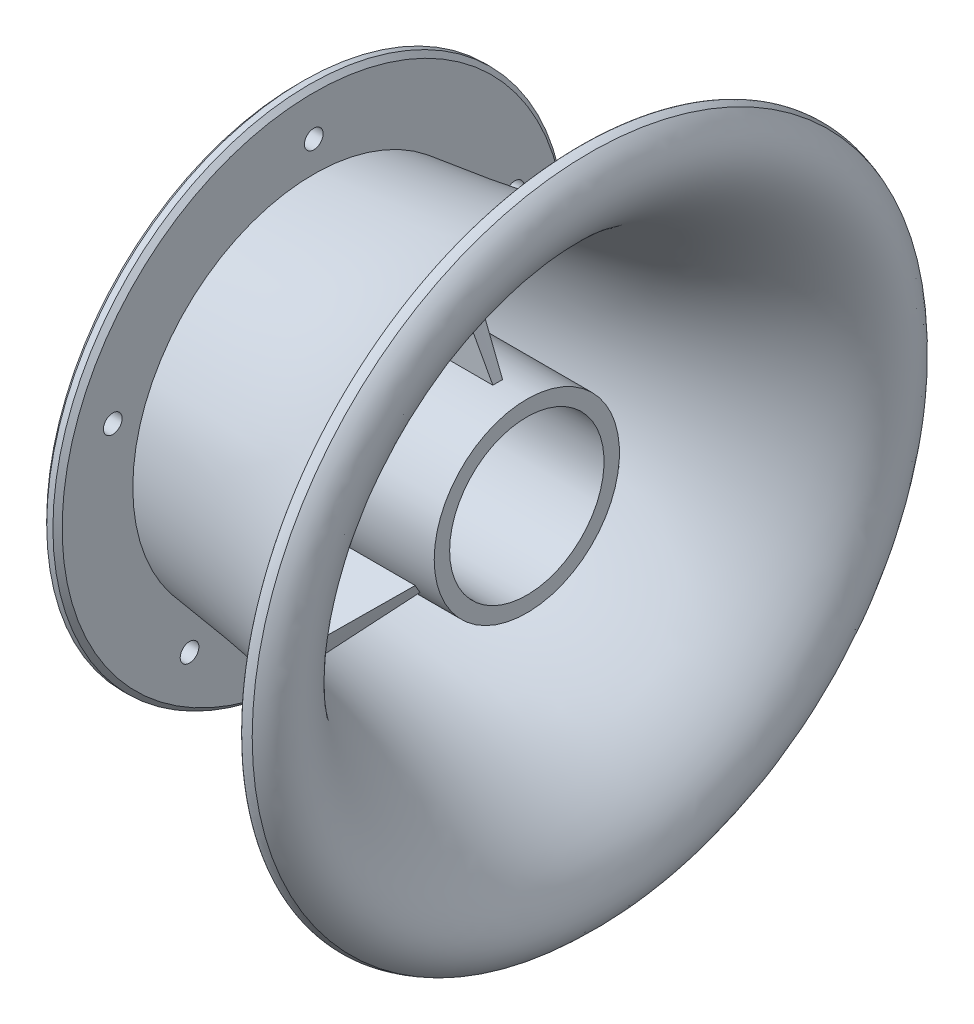
ISO-10303-21;
HEADER;
FILE_DESCRIPTION(('STEP AP214'),'2;1');
FILE_NAME('part.step','',(''),(''),'','','');
FILE_SCHEMA(('AUTOMOTIVE_DESIGN { 1 0 10303 214 1 1 1 1 }'));
ENDSEC;
DATA;
#1=APPLICATION_CONTEXT('core data for automotive mechanical design processes');
#2=APPLICATION_PROTOCOL_DEFINITION('international standard','automotive_design',2000,#1);
#3=PRODUCT_CONTEXT('',#1,'mechanical');
#4=PRODUCT('Part','Part','',(#3));
#5=PRODUCT_RELATED_PRODUCT_CATEGORY('part','',(#4));
#6=PRODUCT_DEFINITION_FORMATION('','',#4);
#7=PRODUCT_DEFINITION_CONTEXT('part definition',#1,'design');
#8=PRODUCT_DEFINITION('design','',#6,#7);
#9=PRODUCT_DEFINITION_SHAPE('','',#8);
#10=(LENGTH_UNIT() NAMED_UNIT(*) SI_UNIT(.MILLI.,.METRE.));
#11=(NAMED_UNIT(*) PLANE_ANGLE_UNIT() SI_UNIT($,.RADIAN.));
#12=(NAMED_UNIT(*) SI_UNIT($,.STERADIAN.) SOLID_ANGLE_UNIT());
#13=UNCERTAINTY_MEASURE_WITH_UNIT(LENGTH_MEASURE(1.E-05),#10,'distance_accuracy_value','');
#14=(GEOMETRIC_REPRESENTATION_CONTEXT(3) GLOBAL_UNCERTAINTY_ASSIGNED_CONTEXT((#13)) GLOBAL_UNIT_ASSIGNED_CONTEXT((#10,
#11,#12)) REPRESENTATION_CONTEXT('',''));
#15=CARTESIAN_POINT('',(0.,0.,0.));
#16=DIRECTION('',(0.,0.,1.));
#17=DIRECTION('',(1.,0.,0.));
#18=AXIS2_PLACEMENT_3D('',#15,#16,#17);
#19=CARTESIAN_POINT('',(0.,-27.231951750751,41.9335283972715));
#20=CARTESIAN_POINT('',(27.0974458304897,-30.93647253479,47.6379901603362));
#21=CARTESIAN_POINT('',(62.5423853870028,-28.8276869558013,44.3907451310539));
#22=CARTESIAN_POINT('',(108.9369423421,-52.9023203584547,81.462429624481));
#23=CARTESIAN_POINT('',(94.3435968032196,-59.5261281442564,91.6621991608794));
#24=B_SPLINE_CURVE_WITH_KNOTS('',3,(#19,#20,#21,#22,#23),.UNSPECIFIED.,.F.,.F.,(4,1,4),(0.,
0.617162194181645,1.),.UNSPECIFIED.);
#25=CARTESIAN_POINT('',(0.,0.,0.));
#26=DIRECTION('',(-1.,0.,0.));
#27=AXIS1_PLACEMENT('',#25,#26);
#28=SURFACE_OF_REVOLUTION('',#24,#27);
#29=CARTESIAN_POINT('',(23.2100864138461,0.,0.));
#30=DIRECTION('',(-1.,0.,0.));
#31=DIRECTION('',(0.,-0.866025403784443,-0.499999999999992));
#32=AXIS2_PLACEMENT_3D('',#29,#30,#31);
#33=CIRCLE('',#32,54.3792883998535);
#34=CARTESIAN_POINT('',(23.2100864138461,-29.6170831588997,45.6063086867734));
#35=VERTEX_POINT('',#34);
#36=CARTESIAN_POINT('',(23.2100864138461,-24.68768031613,48.4523007449906));
#37=VERTEX_POINT('',#36);
#38=EDGE_CURVE('E12',#35,#37,#33,.T.);
#39=ORIENTED_EDGE('',*,*,#38,.F.);
#40=CARTESIAN_POINT('',(50.7294225341509,-32.5143172846174,50.0676580089343));
#41=VERTEX_POINT('',#40);
#42=EDGE_CURVE('E124',#35,#41,#24,.T.);
#43=ORIENTED_EDGE('',*,*,#42,.T.);
#44=CARTESIAN_POINT('',(50.7294225341509,0.,0.));
#45=DIRECTION('',(-1.,0.,0.));
#46=DIRECTION('',(0.,-0.866025403784443,-0.499999999999992));
#47=AXIS2_PLACEMENT_3D('',#44,#45,#46);
#48=CIRCLE('',#47,59.6988375681166);
#49=CARTESIAN_POINT('',(50.7294225341509,-27.1027051014188,53.1920537596538));
#50=VERTEX_POINT('',#49);
#51=EDGE_CURVE('E75',#41,#50,#48,.T.);
#52=ORIENTED_EDGE('',*,*,#51,.T.);
#53=CARTESIAN_POINT('',(0.,-22.6995249869769,44.5503262094186));
#54=CARTESIAN_POINT('',(27.0974458304897,-25.7874733966883,50.6107661987763));
#55=CARTESIAN_POINT('',(62.5423853870028,-24.0296694985116,47.1608818015966));
#56=CARTESIAN_POINT('',(108.9369423421,-44.0973733295736,86.5459681618058));
#57=CARTESIAN_POINT('',(94.3435968032196,-49.6187289679402,97.3822387422945));
#58=B_SPLINE_CURVE_WITH_KNOTS('',3,(#53,#54,#55,#56,#57),.UNSPECIFIED.,.F.,.F.,(4,1,4),(0.,
0.617162194181645,1.),.UNSPECIFIED.);
#59=EDGE_CURVE('E111',#37,#50,#58,.T.);
#60=ORIENTED_EDGE('',*,*,#59,.F.);
#61=EDGE_LOOP('',(#39,#43,#52,#60));
#62=FACE_BOUND('',#61,.T.);
#63=ADVANCED_FACE('F60',(#62),#28,.F.);
#64=CARTESIAN_POINT('',(34.5788731725122,0.,0.));
#65=DIRECTION('',(-1.,0.,0.));
#66=DIRECTION('',(0.,-0.866025403784443,-0.499999999999992));
#67=AXIS2_PLACEMENT_3D('',#64,#65,#66);
#68=CONICAL_SURFACE('',#67,30.,1.13444589163211);
#69=CARTESIAN_POINT('',(34.5788731725122,0.,0.));
#70=DIRECTION('',(-1.,0.,0.));
#71=DIRECTION('',(0.,-0.866025403784443,-0.499999999999992));
#72=AXIS2_PLACEMENT_3D('',#69,#70,#71);
#73=CIRCLE('',#72,30.);
#74=CARTESIAN_POINT('',(34.5788731725122,-16.3391710504506,25.1601170383629));
#75=VERTEX_POINT('',#74);
#76=CARTESIAN_POINT('',(34.5788731725122,-13.6197149921862,26.7301957256512));
#77=VERTEX_POINT('',#76);
#78=EDGE_CURVE('E68',#75,#77,#73,.T.);
#79=ORIENTED_EDGE('',*,*,#78,.F.);
#80=DIRECTION('',(-0.422634685929842,-0.493606427218871,0.760087243188047));
#81=VECTOR('',#80,1.);
#82=CARTESIAN_POINT('',(39.8934082582112,-10.1321824541178,15.6021927680732));
#83=LINE('',#82,#81);
#84=EDGE_CURVE('E107',#75,#35,#83,.T.);
#85=ORIENTED_EDGE('',*,*,#84,.T.);
#86=ORIENTED_EDGE('',*,*,#38,.T.);
#87=DIRECTION('',(-0.422634685929842,-0.411451648083879,0.807519327036848));
#88=VECTOR('',#87,1.);
#89=CARTESIAN_POINT('',(39.8934082582112,-8.44580406483402,16.5758237850817));
#90=LINE('',#89,#88);
#91=EDGE_CURVE('E104',#77,#37,#90,.T.);
#92=ORIENTED_EDGE('',*,*,#91,.F.);
#93=EDGE_LOOP('',(#79,#85,#86,#92));
#94=FACE_BOUND('',#93,.T.);
#95=ADVANCED_FACE('F62',(#94),#68,.F.);
#96=CARTESIAN_POINT('',(0.,0.,0.));
#97=DIRECTION('',(-1.,0.,0.));
#98=DIRECTION('',(0.,-0.866025403784443,-0.499999999999992));
#99=AXIS2_PLACEMENT_3D('',#96,#97,#98);
#100=CYLINDRICAL_SURFACE('',#99,30.);
#101=CARTESIAN_POINT('',(64.5788731725122,0.,0.));
#102=DIRECTION('',(-1.,0.,0.));
#103=DIRECTION('',(0.,-0.866025403784443,-0.499999999999992));
#104=AXIS2_PLACEMENT_3D('',#101,#102,#103);
#105=CIRCLE('',#104,30.);
#106=CARTESIAN_POINT('',(64.5788731725122,-16.3391710504506,25.1601170383629));
#107=VERTEX_POINT('',#106);
#108=CARTESIAN_POINT('',(64.5788731725122,-13.6197149921862,26.7301957256512));
#109=VERTEX_POINT('',#108);
#110=EDGE_CURVE('E83',#107,#109,#105,.T.);
#111=ORIENTED_EDGE('',*,*,#110,.F.);
#112=DIRECTION('',(1.,0.,0.));
#113=VECTOR('',#112,1.);
#114=CARTESIAN_POINT('',(0.,-16.3391710504506,25.1601170383629));
#115=LINE('',#114,#113);
#116=EDGE_CURVE('E185',#75,#107,#115,.T.);
#117=ORIENTED_EDGE('',*,*,#116,.F.);
#118=ORIENTED_EDGE('',*,*,#78,.T.);
#119=DIRECTION('',(1.,0.,0.));
#120=VECTOR('',#119,1.);
#121=CARTESIAN_POINT('',(0.,-13.6197149921862,26.7301957256512));
#122=LINE('',#121,#120);
#123=EDGE_CURVE('E116',#77,#109,#122,.T.);
#124=ORIENTED_EDGE('',*,*,#123,.T.);
#125=EDGE_LOOP('',(#111,#117,#118,#124));
#126=FACE_BOUND('',#125,.T.);
#127=ADVANCED_FACE('F141',(#126),#100,.F.);
#128=CARTESIAN_POINT('',(64.5788731725122,0.,0.));
#129=DIRECTION('',(-1.,0.,0.));
#130=DIRECTION('',(0.,-0.866025403784443,-0.499999999999992));
#131=AXIS2_PLACEMENT_3D('',#128,#129,#130);
#132=CONICAL_SURFACE('',#131,30.,1.13444589163215);
#133=DIRECTION('',(-0.422634685929804,-0.49360642721888,0.760087243188062));
#134=VECTOR('',#133,1.);
#135=CARTESIAN_POINT('',(64.534805925682,-16.3906383743343,25.2393697671928));
#136=LINE('',#135,#134);
#137=EDGE_CURVE('E184',#107,#41,#136,.T.);
#138=ORIENTED_EDGE('',*,*,#137,.F.);
#139=ORIENTED_EDGE('',*,*,#110,.T.);
#140=DIRECTION('',(-0.422634685929804,-0.411451648083887,0.807519327036864));
#141=VECTOR('',#140,1.);
#142=CARTESIAN_POINT('',(64.534805925682,-13.6626162067302,26.8143941000142));
#143=LINE('',#142,#141);
#144=EDGE_CURVE('E118',#109,#50,#143,.T.);
#145=ORIENTED_EDGE('',*,*,#144,.T.);
#146=ORIENTED_EDGE('',*,*,#51,.F.);
#147=EDGE_LOOP('',(#138,#139,#145,#146));
#148=FACE_BOUND('',#147,.T.);
#149=ADVANCED_FACE('F139',(#148),#132,.T.);
#150=CARTESIAN_POINT('',(0.,0.,0.));
#151=DIRECTION('',(0.,-0.838670567945429,-0.544639035015019));
#152=DIRECTION('',(1.,0.,0.));
#153=AXIS2_PLACEMENT_3D('',#150,#151,#152);
#154=PLANE('',#153);
#155=ORIENTED_EDGE('',*,*,#42,.F.);
#156=ORIENTED_EDGE('',*,*,#84,.F.);
#157=ORIENTED_EDGE('',*,*,#116,.T.);
#158=ORIENTED_EDGE('',*,*,#137,.T.);
#159=EDGE_LOOP('',(#155,#156,#157,#158));
#160=FACE_BOUND('',#159,.T.);
#161=ADVANCED_FACE('F137',(#160),#154,.T.);
#162=CARTESIAN_POINT('',(0.,0.,0.));
#163=DIRECTION('',(0.,-0.891006524188372,-0.453990499739538));
#164=DIRECTION('',(1.,0.,0.));
#165=AXIS2_PLACEMENT_3D('',#162,#163,#164);
#166=PLANE('',#165);
#167=ORIENTED_EDGE('',*,*,#59,.T.);
#168=ORIENTED_EDGE('',*,*,#144,.F.);
#169=ORIENTED_EDGE('',*,*,#123,.F.);
#170=ORIENTED_EDGE('',*,*,#91,.T.);
#171=EDGE_LOOP('',(#167,#168,#169,#170));
#172=FACE_BOUND('',#171,.T.);
#173=ADVANCED_FACE('F115',(#172),#166,.F.);
#174=CLOSED_SHELL('',(#63,#95,#127,#149,#161,#173));
#175=MANIFOLD_SOLID_BREP('B2',#174);
#176=CARTESIAN_POINT('',(0.,-22.6995249869776,-44.5503262094183));
#177=CARTESIAN_POINT('',(27.0974458304897,-25.787473396689,-50.6107661987759));
#178=CARTESIAN_POINT('',(62.5423853870028,-24.0296694985122,-47.1608818015963));
#179=CARTESIAN_POINT('',(108.9369423421,-44.0973733295748,-86.5459681618052));
#180=CARTESIAN_POINT('',(94.3435968032196,-49.6187289679416,-97.3822387422938));
#181=B_SPLINE_CURVE_WITH_KNOTS('',3,(#176,#177,#178,#179,#180),.UNSPECIFIED.,.F.,.F.,(4,1,4),
(0.,0.617162194181645,1.),.UNSPECIFIED.);
#182=CARTESIAN_POINT('',(0.,0.,0.));
#183=DIRECTION('',(-1.,0.,0.));
#184=AXIS1_PLACEMENT('',#182,#183);
#185=SURFACE_OF_REVOLUTION('',#181,#184);
#186=CARTESIAN_POINT('',(23.2100864138461,0.,0.));
#187=DIRECTION('',(-1.,0.,0.));
#188=DIRECTION('',(0.,0.866025403784436,-0.500000000000004));
#189=AXIS2_PLACEMENT_3D('',#186,#187,#188);
#190=CIRCLE('',#189,54.3792883998535);
#191=CARTESIAN_POINT('',(23.2100864138461,-24.6876803161307,-48.4523007449902));
#192=VERTEX_POINT('',#191);
#193=CARTESIAN_POINT('',(23.2100864138461,-29.6170831589003,-45.606308686773));
#194=VERTEX_POINT('',#193);
#195=EDGE_CURVE('E58',#192,#194,#190,.T.);
#196=ORIENTED_EDGE('',*,*,#195,.F.);
#197=CARTESIAN_POINT('',(50.7294225341509,-27.1027051014195,-53.1920537596534));
#198=VERTEX_POINT('',#197);
#199=EDGE_CURVE('E269',#192,#198,#181,.T.);
#200=ORIENTED_EDGE('',*,*,#199,.T.);
#201=CARTESIAN_POINT('',(50.7294225341509,0.,0.));
#202=DIRECTION('',(-1.,0.,0.));
#203=DIRECTION('',(0.,0.866025403784436,-0.500000000000004));
#204=AXIS2_PLACEMENT_3D('',#201,#202,#203);
#205=CIRCLE('',#204,59.6988375681166);
#206=CARTESIAN_POINT('',(50.7294225341509,-32.5143172846181,-50.0676580089338));
#207=VERTEX_POINT('',#206);
#208=EDGE_CURVE('E220',#198,#207,#205,.T.);
#209=ORIENTED_EDGE('',*,*,#208,.T.);
#210=CARTESIAN_POINT('',(0.,-27.2319517507516,-41.9335283972711));
#211=CARTESIAN_POINT('',(27.0974458304897,-30.9364725347907,-47.6379901603358));
#212=CARTESIAN_POINT('',(62.5423853870028,-28.8276869558019,-44.3907451310535));
#213=CARTESIAN_POINT('',(108.9369423421,-52.9023203584559,-81.4624296244803));
#214=CARTESIAN_POINT('',(94.3435968032196,-59.5261281442577,-91.6621991608786));
#215=B_SPLINE_CURVE_WITH_KNOTS('',3,(#210,#211,#212,#213,#214),.UNSPECIFIED.,.F.,.F.,(4,1,4),
(0.,0.617162194181645,1.),.UNSPECIFIED.);
#216=EDGE_CURVE('E256',#194,#207,#215,.T.);
#217=ORIENTED_EDGE('',*,*,#216,.F.);
#218=EDGE_LOOP('',(#196,#200,#209,#217));
#219=FACE_BOUND('',#218,.T.);
#220=ADVANCED_FACE('F205',(#219),#185,.F.);
#221=CARTESIAN_POINT('',(34.5788731725122,0.,0.));
#222=DIRECTION('',(-1.,0.,0.));
#223=DIRECTION('',(0.,0.866025403784436,-0.500000000000004));
#224=AXIS2_PLACEMENT_3D('',#221,#222,#223);
#225=CONICAL_SURFACE('',#224,30.,1.13444589163211);
#226=CARTESIAN_POINT('',(34.5788731725122,0.,0.));
#227=DIRECTION('',(-1.,0.,0.));
#228=DIRECTION('',(0.,0.866025403784436,-0.500000000000004));
#229=AXIS2_PLACEMENT_3D('',#226,#227,#228);
#230=CIRCLE('',#229,30.);
#231=CARTESIAN_POINT('',(34.5788731725122,-13.6197149921865,-26.730195725651));
#232=VERTEX_POINT('',#231);
#233=CARTESIAN_POINT('',(34.5788731725122,-16.3391710504509,-25.1601170383627));
#234=VERTEX_POINT('',#233);
#235=EDGE_CURVE('E213',#232,#234,#230,.T.);
#236=ORIENTED_EDGE('',*,*,#235,.F.);
#237=DIRECTION('',(-0.422634685929842,-0.41145164808389,-0.807519327036842));
#238=VECTOR('',#237,1.);
#239=CARTESIAN_POINT('',(39.8934082582112,-8.44580406483425,-16.5758237850816));
#240=LINE('',#239,#238);
#241=EDGE_CURVE('E252',#232,#192,#240,.T.);
#242=ORIENTED_EDGE('',*,*,#241,.T.);
#243=ORIENTED_EDGE('',*,*,#195,.T.);
#244=DIRECTION('',(-0.422634685929842,-0.493606427218881,-0.760087243188041));
#245=VECTOR('',#244,1.);
#246=CARTESIAN_POINT('',(39.8934082582112,-10.132182454118,-15.6021927680731));
#247=LINE('',#246,#245);
#248=EDGE_CURVE('E249',#234,#194,#247,.T.);
#249=ORIENTED_EDGE('',*,*,#248,.F.);
#250=EDGE_LOOP('',(#236,#242,#243,#249));
#251=FACE_BOUND('',#250,.T.);
#252=ADVANCED_FACE('F207',(#251),#225,.F.);
#253=CARTESIAN_POINT('',(0.,0.,0.));
#254=DIRECTION('',(-1.,0.,0.));
#255=DIRECTION('',(0.,0.866025403784436,-0.500000000000004));
#256=AXIS2_PLACEMENT_3D('',#253,#254,#255);
#257=CYLINDRICAL_SURFACE('',#256,30.);
#258=CARTESIAN_POINT('',(64.5788731725122,0.,0.));
#259=DIRECTION('',(-1.,0.,0.));
#260=DIRECTION('',(0.,0.866025403784436,-0.500000000000004));
#261=AXIS2_PLACEMENT_3D('',#258,#259,#260);
#262=CIRCLE('',#261,30.);
#263=CARTESIAN_POINT('',(64.5788731725122,-13.6197149921865,-26.730195725651));
#264=VERTEX_POINT('',#263);
#265=CARTESIAN_POINT('',(64.5788731725122,-16.3391710504509,-25.1601170383627));
#266=VERTEX_POINT('',#265);
#267=EDGE_CURVE('E228',#264,#266,#262,.T.);
#268=ORIENTED_EDGE('',*,*,#267,.F.);
#269=DIRECTION('',(1.,0.,0.));
#270=VECTOR('',#269,1.);
#271=CARTESIAN_POINT('',(0.,-13.6197149921865,-26.730195725651));
#272=LINE('',#271,#270);
#273=EDGE_CURVE('E330',#232,#264,#272,.T.);
#274=ORIENTED_EDGE('',*,*,#273,.F.);
#275=ORIENTED_EDGE('',*,*,#235,.T.);
#276=DIRECTION('',(1.,0.,0.));
#277=VECTOR('',#276,1.);
#278=CARTESIAN_POINT('',(0.,-16.3391710504509,-25.1601170383627));
#279=LINE('',#278,#277);
#280=EDGE_CURVE('E261',#234,#266,#279,.T.);
#281=ORIENTED_EDGE('',*,*,#280,.T.);
#282=EDGE_LOOP('',(#268,#274,#275,#281));
#283=FACE_BOUND('',#282,.T.);
#284=ADVANCED_FACE('F286',(#283),#257,.F.);
#285=CARTESIAN_POINT('',(64.5788731725122,0.,0.));
#286=DIRECTION('',(-1.,0.,0.));
#287=DIRECTION('',(0.,0.866025403784436,-0.500000000000004));
#288=AXIS2_PLACEMENT_3D('',#285,#286,#287);
#289=CONICAL_SURFACE('',#288,30.,1.13444589163215);
#290=DIRECTION('',(-0.422634685929804,-0.411451648083898,-0.807519327036858));
#291=VECTOR('',#290,1.);
#292=CARTESIAN_POINT('',(64.534805925682,-13.6626162067306,-26.814394100014));
#293=LINE('',#292,#291);
#294=EDGE_CURVE('E329',#264,#198,#293,.T.);
#295=ORIENTED_EDGE('',*,*,#294,.F.);
#296=ORIENTED_EDGE('',*,*,#267,.T.);
#297=DIRECTION('',(-0.422634685929804,-0.493606427218891,-0.760087243188055));
#298=VECTOR('',#297,1.);
#299=CARTESIAN_POINT('',(64.534805925682,-16.3906383743347,-25.2393697671925));
#300=LINE('',#299,#298);
#301=EDGE_CURVE('E263',#266,#207,#300,.T.);
#302=ORIENTED_EDGE('',*,*,#301,.T.);
#303=ORIENTED_EDGE('',*,*,#208,.F.);
#304=EDGE_LOOP('',(#295,#296,#302,#303));
#305=FACE_BOUND('',#304,.T.);
#306=ADVANCED_FACE('F284',(#305),#289,.T.);
#307=CARTESIAN_POINT('',(0.,0.,0.));
#308=DIRECTION('',(0.,0.891006524188366,-0.453990499739551));
#309=DIRECTION('',(1.,0.,0.));
#310=AXIS2_PLACEMENT_3D('',#307,#308,#309);
#311=PLANE('',#310);
#312=ORIENTED_EDGE('',*,*,#199,.F.);
#313=ORIENTED_EDGE('',*,*,#241,.F.);
#314=ORIENTED_EDGE('',*,*,#273,.T.);
#315=ORIENTED_EDGE('',*,*,#294,.T.);
#316=EDGE_LOOP('',(#312,#313,#314,#315));
#317=FACE_BOUND('',#316,.T.);
#318=ADVANCED_FACE('F282',(#317),#311,.T.);
#319=CARTESIAN_POINT('',(0.,0.,0.));
#320=DIRECTION('',(0.,0.838670567945422,-0.544639035015031));
#321=DIRECTION('',(1.,0.,0.));
#322=AXIS2_PLACEMENT_3D('',#319,#320,#321);
#323=PLANE('',#322);
#324=ORIENTED_EDGE('',*,*,#216,.T.);
#325=ORIENTED_EDGE('',*,*,#301,.F.);
#326=ORIENTED_EDGE('',*,*,#280,.F.);
#327=ORIENTED_EDGE('',*,*,#248,.T.);
#328=EDGE_LOOP('',(#324,#325,#326,#327));
#329=FACE_BOUND('',#328,.T.);
#330=ADVANCED_FACE('F260',(#329),#323,.F.);
#331=CLOSED_SHELL('',(#220,#252,#284,#306,#318,#330));
#332=MANIFOLD_SOLID_BREP('B6',#331);
#333=CARTESIAN_POINT('',(0.,49.9314767377287,2.6167978121472));
#334=CARTESIAN_POINT('',(27.0974458304897,56.7239459314793,2.97277603844013));
#335=CARTESIAN_POINT('',(62.5423853870028,52.8573564543137,2.77013667054271));
#336=CARTESIAN_POINT('',(108.9369423421,96.9996936880299,5.08353853732489));
#337=CARTESIAN_POINT('',(94.3435968032196,109.144857112198,5.72003958141517));
#338=B_SPLINE_CURVE_WITH_KNOTS('',3,(#333,#334,#335,#336,#337),.UNSPECIFIED.,.F.,.F.,(4,1,4),
(0.,0.617162194181645,1.),.UNSPECIFIED.);
#339=CARTESIAN_POINT('',(0.,0.,0.));
#340=DIRECTION('',(-1.,0.,0.));
#341=AXIS1_PLACEMENT('',#339,#340);
#342=SURFACE_OF_REVOLUTION('',#338,#341);
#343=CARTESIAN_POINT('',(23.2100864138461,0.,0.));
#344=DIRECTION('',(-1.,0.,0.));
#345=DIRECTION('',(0.,0.,1.));
#346=AXIS2_PLACEMENT_3D('',#343,#344,#345);
#347=CIRCLE('',#346,54.3792883998535);
#348=CARTESIAN_POINT('',(23.2100864138461,54.3047634750305,2.84599205821716));
#349=VERTEX_POINT('',#348);
#350=CARTESIAN_POINT('',(23.2100864138461,54.3047634750305,-2.84599205821716));
#351=VERTEX_POINT('',#350);
#352=EDGE_CURVE('E203',#349,#351,#347,.T.);
#353=ORIENTED_EDGE('',*,*,#352,.F.);
#354=CARTESIAN_POINT('',(50.7294225341509,59.6170223860372,3.12439575071957));
#355=VERTEX_POINT('',#354);
#356=EDGE_CURVE('E412',#349,#355,#338,.T.);
#357=ORIENTED_EDGE('',*,*,#356,.T.);
#358=CARTESIAN_POINT('',(50.7294225341509,0.,0.));
#359=DIRECTION('',(-1.,0.,0.));
#360=DIRECTION('',(0.,0.,1.));
#361=AXIS2_PLACEMENT_3D('',#358,#359,#360);
#362=CIRCLE('',#361,59.6988375681166);
#363=CARTESIAN_POINT('',(50.7294225341509,59.6170223860372,-3.12439575071957));
#364=VERTEX_POINT('',#363);
#365=EDGE_CURVE('E363',#355,#364,#362,.T.);
#366=ORIENTED_EDGE('',*,*,#365,.T.);
#367=CARTESIAN_POINT('',(0.,49.9314767377287,-2.6167978121472));
#368=CARTESIAN_POINT('',(27.0974458304897,56.7239459314793,-2.97277603844013));
#369=CARTESIAN_POINT('',(62.5423853870028,52.8573564543137,-2.77013667054271));
#370=CARTESIAN_POINT('',(108.9369423421,96.9996936880299,-5.08353853732489));
#371=CARTESIAN_POINT('',(94.3435968032196,109.144857112198,-5.72003958141517));
#372=B_SPLINE_CURVE_WITH_KNOTS('',3,(#367,#368,#369,#370,#371),.UNSPECIFIED.,.F.,.F.,(4,1,4),
(0.,0.617162194181645,1.),.UNSPECIFIED.);
#373=EDGE_CURVE('E399',#351,#364,#372,.T.);
#374=ORIENTED_EDGE('',*,*,#373,.F.);
#375=EDGE_LOOP('',(#353,#357,#366,#374));
#376=FACE_BOUND('',#375,.T.);
#377=ADVANCED_FACE('F348',(#376),#342,.F.);
#378=CARTESIAN_POINT('',(34.5788731725122,0.,0.));
#379=DIRECTION('',(-1.,0.,0.));
#380=DIRECTION('',(0.,0.,1.));
#381=AXIS2_PLACEMENT_3D('',#378,#379,#380);
#382=CONICAL_SURFACE('',#381,30.,1.13444589163211);
#383=CARTESIAN_POINT('',(34.5788731725122,0.,0.));
#384=DIRECTION('',(-1.,0.,0.));
#385=DIRECTION('',(0.,0.,1.));
#386=AXIS2_PLACEMENT_3D('',#383,#384,#385);
#387=CIRCLE('',#386,30.);
#388=CARTESIAN_POINT('',(34.5788731725122,29.9588860426372,1.57007868728832));
#389=VERTEX_POINT('',#388);
#390=CARTESIAN_POINT('',(34.5788731725122,29.9588860426372,-1.57007868728832));
#391=VERTEX_POINT('',#390);
#392=EDGE_CURVE('E356',#389,#391,#387,.T.);
#393=ORIENTED_EDGE('',*,*,#392,.F.);
#394=DIRECTION('',(-0.422634685929842,0.905058075302764,0.0474320838488015));
#395=VECTOR('',#394,1.);
#396=CARTESIAN_POINT('',(39.8934082582112,18.5779865189521,0.97363101700856));
#397=LINE('',#396,#395);
#398=EDGE_CURVE('E395',#389,#349,#397,.T.);
#399=ORIENTED_EDGE('',*,*,#398,.T.);
#400=ORIENTED_EDGE('',*,*,#352,.T.);
#401=DIRECTION('',(-0.422634685929842,0.905058075302764,-0.0474320838488015));
#402=VECTOR('',#401,1.);
#403=CARTESIAN_POINT('',(39.8934082582112,18.5779865189521,-0.973631017008561));
#404=LINE('',#403,#402);
#405=EDGE_CURVE('E392',#391,#351,#404,.T.);
#406=ORIENTED_EDGE('',*,*,#405,.F.);
#407=EDGE_LOOP('',(#393,#399,#400,#406));
#408=FACE_BOUND('',#407,.T.);
#409=ADVANCED_FACE('F350',(#408),#382,.F.);
#410=CARTESIAN_POINT('',(0.,0.,0.));
#411=DIRECTION('',(-1.,0.,0.));
#412=DIRECTION('',(0.,0.,1.));
#413=AXIS2_PLACEMENT_3D('',#410,#411,#412);
#414=CYLINDRICAL_SURFACE('',#413,30.);
#415=CARTESIAN_POINT('',(64.5788731725122,0.,0.));
#416=DIRECTION('',(-1.,0.,0.));
#417=DIRECTION('',(0.,0.,1.));
#418=AXIS2_PLACEMENT_3D('',#415,#416,#417);
#419=CIRCLE('',#418,30.);
#420=CARTESIAN_POINT('',(64.5788731725122,29.9588860426372,1.57007868728832));
#421=VERTEX_POINT('',#420);
#422=CARTESIAN_POINT('',(64.5788731725122,29.9588860426372,-1.57007868728832));
#423=VERTEX_POINT('',#422);
#424=EDGE_CURVE('E371',#421,#423,#419,.T.);
#425=ORIENTED_EDGE('',*,*,#424,.F.);
#426=DIRECTION('',(1.,0.,0.));
#427=VECTOR('',#426,1.);
#428=CARTESIAN_POINT('',(0.,29.9588860426372,1.57007868728832));
#429=LINE('',#428,#427);
#430=EDGE_CURVE('E473',#389,#421,#429,.T.);
#431=ORIENTED_EDGE('',*,*,#430,.F.);
#432=ORIENTED_EDGE('',*,*,#392,.T.);
#433=DIRECTION('',(1.,0.,0.));
#434=VECTOR('',#433,1.);
#435=CARTESIAN_POINT('',(0.,29.9588860426372,-1.57007868728832));
#436=LINE('',#435,#434);
#437=EDGE_CURVE('E404',#391,#423,#436,.T.);
#438=ORIENTED_EDGE('',*,*,#437,.T.);
#439=EDGE_LOOP('',(#425,#431,#432,#438));
#440=FACE_BOUND('',#439,.T.);
#441=ADVANCED_FACE('F429',(#440),#414,.F.);
#442=CARTESIAN_POINT('',(64.5788731725122,0.,0.));
#443=DIRECTION('',(-1.,0.,0.));
#444=DIRECTION('',(0.,0.,1.));
#445=AXIS2_PLACEMENT_3D('',#442,#443,#444);
#446=CONICAL_SURFACE('',#445,30.,1.13444589163215);
#447=DIRECTION('',(-0.422634685929804,0.905058075302782,0.0474320838488024));
#448=VECTOR('',#447,1.);
#449=CARTESIAN_POINT('',(64.534805925682,30.053254581065,1.57502433282151));
#450=LINE('',#449,#448);
#451=EDGE_CURVE('E472',#421,#355,#450,.T.);
#452=ORIENTED_EDGE('',*,*,#451,.F.);
#453=ORIENTED_EDGE('',*,*,#424,.T.);
#454=DIRECTION('',(-0.422634685929804,0.905058075302782,-0.0474320838488024));
#455=VECTOR('',#454,1.);
#456=CARTESIAN_POINT('',(64.534805925682,30.053254581065,-1.57502433282151));
#457=LINE('',#456,#455);
#458=EDGE_CURVE('E406',#423,#364,#457,.T.);
#459=ORIENTED_EDGE('',*,*,#458,.T.);
#460=ORIENTED_EDGE('',*,*,#365,.F.);
#461=EDGE_LOOP('',(#452,#453,#459,#460));
#462=FACE_BOUND('',#461,.T.);
#463=ADVANCED_FACE('F427',(#462),#446,.T.);
#464=CARTESIAN_POINT('',(0.,0.,0.));
#465=DIRECTION('',(0.,-0.052335956242944,0.998629534754574));
#466=DIRECTION('',(1.,0.,0.));
#467=AXIS2_PLACEMENT_3D('',#464,#465,#466);
#468=PLANE('',#467);
#469=ORIENTED_EDGE('',*,*,#356,.F.);
#470=ORIENTED_EDGE('',*,*,#398,.F.);
#471=ORIENTED_EDGE('',*,*,#430,.T.);
#472=ORIENTED_EDGE('',*,*,#451,.T.);
#473=EDGE_LOOP('',(#469,#470,#471,#472));
#474=FACE_BOUND('',#473,.T.);
#475=ADVANCED_FACE('F425',(#474),#468,.T.);
#476=CARTESIAN_POINT('',(0.,0.,0.));
#477=DIRECTION('',(0.,0.052335956242944,0.998629534754574));
#478=DIRECTION('',(1.,0.,0.));
#479=AXIS2_PLACEMENT_3D('',#476,#477,#478);
#480=PLANE('',#479);
#481=ORIENTED_EDGE('',*,*,#373,.T.);
#482=ORIENTED_EDGE('',*,*,#458,.F.);
#483=ORIENTED_EDGE('',*,*,#437,.F.);
#484=ORIENTED_EDGE('',*,*,#405,.T.);
#485=EDGE_LOOP('',(#481,#482,#483,#484));
#486=FACE_BOUND('',#485,.T.);
#487=ADVANCED_FACE('F403',(#486),#480,.F.);
#488=CLOSED_SHELL('',(#377,#409,#441,#463,#475,#487));
#489=MANIFOLD_SOLID_BREP('B52',#488);
#490=CARTESIAN_POINT('',(30.,0.,0.));
#491=DIRECTION('',(1.,0.,0.));
#492=DIRECTION('',(0.,0.,-1.));
#493=AXIS2_PLACEMENT_3D('',#490,#491,#492);
#494=PLANE('',#493);
#495=CARTESIAN_POINT('',(30.,0.,0.));
#496=DIRECTION('',(-1.,0.,0.));
#497=DIRECTION('',(0.,0.,1.));
#498=AXIS2_PLACEMENT_3D('',#495,#496,#497);
#499=CIRCLE('',#498,8.);
#500=CARTESIAN_POINT('',(30.,0.,8.));
#501=VERTEX_POINT('',#500);
#502=EDGE_CURVE('E524',#501,#501,#499,.T.);
#503=ORIENTED_EDGE('',*,*,#502,.T.);
#504=EDGE_LOOP('',(#503));
#505=FACE_BOUND('',#504,.T.);
#506=CARTESIAN_POINT('',(30.,0.,0.));
#507=DIRECTION('',(-1.,0.,0.));
#508=DIRECTION('',(0.,0.,1.));
#509=AXIS2_PLACEMENT_3D('',#506,#507,#508);
#510=CIRCLE('',#509,25.);
#511=CARTESIAN_POINT('',(30.,0.,25.));
#512=VERTEX_POINT('',#511);
#513=EDGE_CURVE('E347',#512,#512,#510,.T.);
#514=ORIENTED_EDGE('',*,*,#513,.F.);
#515=EDGE_LOOP('',(#514));
#516=FACE_BOUND('',#515,.T.);
#517=ADVANCED_FACE('F490',(#505,#516),#494,.T.);
#518=CARTESIAN_POINT('',(0.,0.,0.));
#519=DIRECTION('',(-1.,0.,0.));
#520=DIRECTION('',(0.,0.,1.));
#521=AXIS2_PLACEMENT_3D('',#518,#519,#520);
#522=CYLINDRICAL_SURFACE('',#521,25.);
#523=ORIENTED_EDGE('',*,*,#513,.T.);
#524=EDGE_LOOP('',(#523));
#525=FACE_BOUND('',#524,.T.);
#526=CARTESIAN_POINT('',(74.,0.,0.));
#527=DIRECTION('',(-1.,0.,0.));
#528=DIRECTION('',(0.,0.,1.));
#529=AXIS2_PLACEMENT_3D('',#526,#527,#528);
#530=CIRCLE('',#529,25.);
#531=CARTESIAN_POINT('',(74.,0.,25.));
#532=VERTEX_POINT('',#531);
#533=EDGE_CURVE('E496',#532,#532,#530,.T.);
#534=ORIENTED_EDGE('',*,*,#533,.F.);
#535=EDGE_LOOP('',(#534));
#536=FACE_BOUND('',#535,.T.);
#537=ADVANCED_FACE('F548',(#525,#536),#522,.F.);
#538=CARTESIAN_POINT('',(74.,2.05391259555654E-13,0.));
#539=DIRECTION('',(1.,0.,0.));
#540=DIRECTION('',(0.,0.,-1.));
#541=AXIS2_PLACEMENT_3D('',#538,#539,#540);
#542=PLANE('',#541);
#543=ORIENTED_EDGE('',*,*,#533,.T.);
#544=EDGE_LOOP('',(#543));
#545=FACE_BOUND('',#544,.T.);
#546=CARTESIAN_POINT('',(74.,0.,0.));
#547=DIRECTION('',(-1.,0.,0.));
#548=DIRECTION('',(0.,0.,1.));
#549=AXIS2_PLACEMENT_3D('',#546,#547,#548);
#550=CIRCLE('',#549,30.);
#551=CARTESIAN_POINT('',(74.,0.,30.));
#552=VERTEX_POINT('',#551);
#553=EDGE_CURVE('E500',#552,#552,#550,.T.);
#554=ORIENTED_EDGE('',*,*,#553,.F.);
#555=EDGE_LOOP('',(#554));
#556=FACE_BOUND('',#555,.T.);
#557=ADVANCED_FACE('F552',(#545,#556),#542,.T.);
#558=CARTESIAN_POINT('',(0.,0.,0.));
#559=DIRECTION('',(-1.,0.,0.));
#560=DIRECTION('',(0.,0.,1.));
#561=AXIS2_PLACEMENT_3D('',#558,#559,#560);
#562=CYLINDRICAL_SURFACE('',#561,30.);
#563=ORIENTED_EDGE('',*,*,#553,.T.);
#564=EDGE_LOOP('',(#563));
#565=FACE_BOUND('',#564,.T.);
#566=CARTESIAN_POINT('',(24.,0.,0.));
#567=DIRECTION('',(-1.,0.,0.));
#568=DIRECTION('',(0.,0.,1.));
#569=AXIS2_PLACEMENT_3D('',#566,#567,#568);
#570=CIRCLE('',#569,30.);
#571=CARTESIAN_POINT('',(24.,0.,30.));
#572=VERTEX_POINT('',#571);
#573=EDGE_CURVE('E504',#572,#572,#570,.T.);
#574=ORIENTED_EDGE('',*,*,#573,.F.);
#575=EDGE_LOOP('',(#574));
#576=FACE_BOUND('',#575,.T.);
#577=ADVANCED_FACE('F556',(#565,#576),#562,.T.);
#578=CARTESIAN_POINT('',(24.,0.,0.));
#579=DIRECTION('',(-1.,0.,0.));
#580=DIRECTION('',(0.,0.,1.));
#581=AXIS2_PLACEMENT_3D('',#578,#579,#580);
#582=PLANE('',#581);
#583=ORIENTED_EDGE('',*,*,#573,.T.);
#584=EDGE_LOOP('',(#583));
#585=FACE_BOUND('',#584,.T.);
#586=CARTESIAN_POINT('',(24.,0.,0.));
#587=DIRECTION('',(-1.,0.,0.));
#588=DIRECTION('',(0.,0.,1.));
#589=AXIS2_PLACEMENT_3D('',#586,#587,#588);
#590=CIRCLE('',#589,18.);
#591=CARTESIAN_POINT('',(24.,0.,18.));
#592=VERTEX_POINT('',#591);
#593=EDGE_CURVE('E509',#592,#592,#590,.T.);
#594=ORIENTED_EDGE('',*,*,#593,.F.);
#595=EDGE_LOOP('',(#594));
#596=FACE_BOUND('',#595,.T.);
#597=ADVANCED_FACE('F562',(#585,#596),#582,.T.);
#598=CARTESIAN_POINT('',(0.,0.,0.));
#599=DIRECTION('',(-1.,0.,0.));
#600=DIRECTION('',(0.,0.,1.));
#601=AXIS2_PLACEMENT_3D('',#598,#599,#600);
#602=CYLINDRICAL_SURFACE('',#601,18.);
#603=ORIENTED_EDGE('',*,*,#593,.T.);
#604=EDGE_LOOP('',(#603));
#605=FACE_BOUND('',#604,.T.);
#606=CARTESIAN_POINT('',(20.,0.,0.));
#607=DIRECTION('',(-1.,0.,0.));
#608=DIRECTION('',(0.,0.,1.));
#609=AXIS2_PLACEMENT_3D('',#606,#607,#608);
#610=CIRCLE('',#609,18.);
#611=CARTESIAN_POINT('',(20.,0.,18.));
#612=VERTEX_POINT('',#611);
#613=EDGE_CURVE('E512',#612,#612,#610,.T.);
#614=ORIENTED_EDGE('',*,*,#613,.F.);
#615=EDGE_LOOP('',(#614));
#616=FACE_BOUND('',#615,.T.);
#617=ADVANCED_FACE('F566',(#605,#616),#602,.T.);
#618=CARTESIAN_POINT('',(20.,0.,0.));
#619=DIRECTION('',(-1.,0.,0.));
#620=DIRECTION('',(0.,0.,1.));
#621=AXIS2_PLACEMENT_3D('',#618,#619,#620);
#622=PLANE('',#621);
#623=ORIENTED_EDGE('',*,*,#613,.T.);
#624=EDGE_LOOP('',(#623));
#625=FACE_BOUND('',#624,.T.);
#626=CARTESIAN_POINT('',(20.,0.,0.));
#627=DIRECTION('',(-1.,0.,0.));
#628=DIRECTION('',(0.,0.,1.));
#629=AXIS2_PLACEMENT_3D('',#626,#627,#628);
#630=CIRCLE('',#629,13.);
#631=CARTESIAN_POINT('',(20.,0.,13.));
#632=VERTEX_POINT('',#631);
#633=EDGE_CURVE('E515',#632,#632,#630,.T.);
#634=ORIENTED_EDGE('',*,*,#633,.F.);
#635=EDGE_LOOP('',(#634));
#636=FACE_BOUND('',#635,.T.);
#637=ADVANCED_FACE('F544',(#625,#636),#622,.T.);
#638=CARTESIAN_POINT('',(0.,0.,0.));
#639=DIRECTION('',(-1.,0.,0.));
#640=DIRECTION('',(0.,0.,1.));
#641=AXIS2_PLACEMENT_3D('',#638,#639,#640);
#642=CYLINDRICAL_SURFACE('',#641,13.);
#643=ORIENTED_EDGE('',*,*,#633,.T.);
#644=EDGE_LOOP('',(#643));
#645=FACE_BOUND('',#644,.T.);
#646=CARTESIAN_POINT('',(25.,0.,0.));
#647=DIRECTION('',(-1.,0.,0.));
#648=DIRECTION('',(0.,0.,1.));
#649=AXIS2_PLACEMENT_3D('',#646,#647,#648);
#650=CIRCLE('',#649,13.);
#651=CARTESIAN_POINT('',(25.,0.,13.));
#652=VERTEX_POINT('',#651);
#653=EDGE_CURVE('E518',#652,#652,#650,.T.);
#654=ORIENTED_EDGE('',*,*,#653,.F.);
#655=EDGE_LOOP('',(#654));
#656=FACE_BOUND('',#655,.T.);
#657=ADVANCED_FACE('F538',(#645,#656),#642,.F.);
#658=CARTESIAN_POINT('',(25.,0.,0.));
#659=DIRECTION('',(-1.,0.,0.));
#660=DIRECTION('',(0.,0.,1.));
#661=AXIS2_PLACEMENT_3D('',#658,#659,#660);
#662=PLANE('',#661);
#663=ORIENTED_EDGE('',*,*,#653,.T.);
#664=EDGE_LOOP('',(#663));
#665=FACE_BOUND('',#664,.T.);
#666=CARTESIAN_POINT('',(25.,0.,0.));
#667=DIRECTION('',(-1.,0.,0.));
#668=DIRECTION('',(0.,0.,1.));
#669=AXIS2_PLACEMENT_3D('',#666,#667,#668);
#670=CIRCLE('',#669,8.);
#671=CARTESIAN_POINT('',(25.,0.,8.));
#672=VERTEX_POINT('',#671);
#673=EDGE_CURVE('E521',#672,#672,#670,.T.);
#674=ORIENTED_EDGE('',*,*,#673,.F.);
#675=EDGE_LOOP('',(#674));
#676=FACE_BOUND('',#675,.T.);
#677=ADVANCED_FACE('F533',(#665,#676),#662,.T.);
#678=CARTESIAN_POINT('',(0.,0.,0.));
#679=DIRECTION('',(-1.,0.,0.));
#680=DIRECTION('',(0.,0.,1.));
#681=AXIS2_PLACEMENT_3D('',#678,#679,#680);
#682=CYLINDRICAL_SURFACE('',#681,8.);
#683=ORIENTED_EDGE('',*,*,#502,.F.);
#684=EDGE_LOOP('',(#683));
#685=FACE_BOUND('',#684,.T.);
#686=ORIENTED_EDGE('',*,*,#673,.T.);
#687=EDGE_LOOP('',(#686));
#688=FACE_BOUND('',#687,.T.);
#689=ADVANCED_FACE('F530',(#685,#688),#682,.F.);
#690=CLOSED_SHELL('',(#517,#537,#557,#577,#597,#617,#637,#657,#677,#689));
#691=MANIFOLD_SOLID_BREP('B197',#690);
#692=CARTESIAN_POINT('',(4.99999999986148,58.6208088529512,0.));
#693=CARTESIAN_POINT('',(13.1690162641069,59.6123570061718,0.));
#694=CARTESIAN_POINT('',(37.2055688662414,62.4507363083367,0.));
#695=CARTESIAN_POINT('',(71.5116197863581,70.1429102901592,0.));
#696=CARTESIAN_POINT('',(103.053430820511,97.0372375688595,0.));
#697=CARTESIAN_POINT('',(92.4772744223302,107.912180597169,0.));
#698=B_SPLINE_CURVE_WITH_KNOTS('',3,(#692,#693,#694,#695,#696,#697),.UNSPECIFIED.,.F.,.F.,(4,1,
1,4),(0.0422430707546907,0.249171508564825,0.641676840403297,1.),.UNSPECIFIED.);
#699=CARTESIAN_POINT('',(0.,0.,0.));
#700=DIRECTION('',(-1.,0.,0.));
#701=AXIS1_PLACEMENT('',#699,#700);
#702=SURFACE_OF_REVOLUTION('',#698,#701);
#703=CARTESIAN_POINT('',(92.4772744223302,0.,0.));
#704=DIRECTION('',(-1.,0.,0.));
#705=DIRECTION('',(0.,0.,1.));
#706=AXIS2_PLACEMENT_3D('',#703,#704,#705);
#707=CIRCLE('',#706,107.912180597169);
#708=CARTESIAN_POINT('',(92.4772744223302,0.,107.912180597169));
#709=VERTEX_POINT('',#708);
#710=EDGE_CURVE('E679',#709,#709,#707,.T.);
#711=ORIENTED_EDGE('',*,*,#710,.T.);
#712=EDGE_LOOP('',(#711));
#713=FACE_BOUND('',#712,.T.);
#714=CARTESIAN_POINT('',(4.99999999986148,0.,0.));
#715=DIRECTION('',(-1.,0.,0.));
#716=DIRECTION('',(0.,0.,1.));
#717=AXIS2_PLACEMENT_3D('',#714,#715,#716);
#718=CIRCLE('',#717,58.6208088529512);
#719=CARTESIAN_POINT('',(4.99999999986148,0.,58.6208088529512));
#720=VERTEX_POINT('',#719);
#721=EDGE_CURVE('E667',#720,#720,#718,.T.);
#722=ORIENTED_EDGE('',*,*,#721,.F.);
#723=EDGE_LOOP('',(#722));
#724=FACE_BOUND('',#723,.T.);
#725=ADVANCED_FACE('F642',(#713,#724),#702,.F.);
#726=CARTESIAN_POINT('',(4.99999999986148,0.,0.));
#727=DIRECTION('',(1.,0.,0.));
#728=DIRECTION('',(0.,0.,-1.));
#729=AXIS2_PLACEMENT_3D('',#726,#727,#728);
#730=PLANE('',#729);
#731=CARTESIAN_POINT('',(4.99999999986148,21.1543292678741,-65.1063309277184));
#732=DIRECTION('',(1.,0.,0.));
#733=DIRECTION('',(0.,0.,-1.));
#734=AXIS2_PLACEMENT_3D('',#731,#732,#733);
#735=CIRCLE('',#734,3.0226);
#736=CARTESIAN_POINT('',(4.99999999986148,21.1543292678741,-68.1289309277184));
#737=VERTEX_POINT('',#736);
#738=EDGE_CURVE('E764',#737,#737,#735,.T.);
#739=ORIENTED_EDGE('',*,*,#738,.F.);
#740=EDGE_LOOP('',(#739));
#741=FACE_BOUND('',#740,.T.);
#742=CARTESIAN_POINT('',(4.99999999986148,-55.3827530324989,-40.2379253961291));
#743=DIRECTION('',(1.,0.,0.));
#744=DIRECTION('',(0.,0.,-1.));
#745=AXIS2_PLACEMENT_3D('',#742,#743,#744);
#746=CIRCLE('',#745,3.0226);
#747=CARTESIAN_POINT('',(4.99999999986148,-55.3827530324989,-43.2605253961291));
#748=VERTEX_POINT('',#747);
#749=EDGE_CURVE('E756',#748,#748,#746,.T.);
#750=ORIENTED_EDGE('',*,*,#749,.F.);
#751=EDGE_LOOP('',(#750));
#752=FACE_BOUND('',#751,.T.);
#753=CARTESIAN_POINT('',(4.99999999986148,-55.3827530324995,40.2379253961283));
#754=DIRECTION('',(1.,0.,0.));
#755=DIRECTION('',(0.,0.,-1.));
#756=AXIS2_PLACEMENT_3D('',#753,#754,#755);
#757=CIRCLE('',#756,3.0226);
#758=CARTESIAN_POINT('',(4.99999999986148,-55.3827530324995,37.2153253961283));
#759=VERTEX_POINT('',#758);
#760=EDGE_CURVE('E748',#759,#759,#757,.T.);
#761=ORIENTED_EDGE('',*,*,#760,.F.);
#762=EDGE_LOOP('',(#761));
#763=FACE_BOUND('',#762,.T.);
#764=CARTESIAN_POINT('',(4.99999999986148,21.1543292678732,65.1063309277187));
#765=DIRECTION('',(1.,0.,0.));
#766=DIRECTION('',(0.,0.,-1.));
#767=AXIS2_PLACEMENT_3D('',#764,#765,#766);
#768=CIRCLE('',#767,3.0226);
#769=CARTESIAN_POINT('',(4.99999999986148,21.1543292678732,62.0837309277187));
#770=VERTEX_POINT('',#769);
#771=EDGE_CURVE('E740',#770,#770,#768,.T.);
#772=ORIENTED_EDGE('',*,*,#771,.F.);
#773=EDGE_LOOP('',(#772));
#774=FACE_BOUND('',#773,.T.);
#775=CARTESIAN_POINT('',(4.99999999986148,68.4568475292517,0.));
#776=DIRECTION('',(1.,0.,0.));
#777=DIRECTION('',(0.,0.,-1.));
#778=AXIS2_PLACEMENT_3D('',#775,#776,#777);
#779=CIRCLE('',#778,3.0226);
#780=CARTESIAN_POINT('',(4.99999999986148,68.4568475292517,-3.0226));
#781=VERTEX_POINT('',#780);
#782=EDGE_CURVE('E732',#781,#781,#779,.T.);
#783=ORIENTED_EDGE('',*,*,#782,.F.);
#784=EDGE_LOOP('',(#783));
#785=FACE_BOUND('',#784,.T.);
#786=CARTESIAN_POINT('',(4.99999999986148,0.,0.));
#787=DIRECTION('',(1.,0.,0.));
#788=DIRECTION('',(0.,0.,-1.));
#789=AXIS2_PLACEMENT_3D('',#786,#787,#788);
#790=CIRCLE('',#789,81.5);
#791=CARTESIAN_POINT('',(4.99999999986148,0.,-81.5));
#792=VERTEX_POINT('',#791);
#793=EDGE_CURVE('E489',#792,#792,#790,.T.);
#794=ORIENTED_EDGE('',*,*,#793,.T.);
#795=EDGE_LOOP('',(#794));
#796=FACE_BOUND('',#795,.T.);
#797=ORIENTED_EDGE('',*,*,#721,.T.);
#798=EDGE_LOOP('',(#797));
#799=FACE_BOUND('',#798,.T.);
#800=ADVANCED_FACE('F715',(#741,#752,#763,#774,#785,#796,#799),#730,.T.);
#801=CARTESIAN_POINT('',(0.,0.,0.));
#802=DIRECTION('',(-1.,0.,0.));
#803=DIRECTION('',(0.,0.,1.));
#804=AXIS2_PLACEMENT_3D('',#801,#802,#803);
#805=CYLINDRICAL_SURFACE('',#804,83.);
#806=CARTESIAN_POINT('',(1.49999999999997,0.,0.));
#807=DIRECTION('',(-1.,0.,0.));
#808=DIRECTION('',(0.,0.,1.));
#809=AXIS2_PLACEMENT_3D('',#806,#807,#808);
#810=CIRCLE('',#809,83.);
#811=CARTESIAN_POINT('',(1.49999999999997,0.,83.));
#812=VERTEX_POINT('',#811);
#813=EDGE_CURVE('E651',#812,#812,#810,.F.);
#814=ORIENTED_EDGE('',*,*,#813,.T.);
#815=EDGE_LOOP('',(#814));
#816=FACE_BOUND('',#815,.T.);
#817=CARTESIAN_POINT('',(3.49999999986145,0.,0.));
#818=DIRECTION('',(1.,0.,0.));
#819=DIRECTION('',(0.,0.,-1.));
#820=AXIS2_PLACEMENT_3D('',#817,#818,#819);
#821=CIRCLE('',#820,83.);
#822=CARTESIAN_POINT('',(3.49999999986145,0.,-83.));
#823=VERTEX_POINT('',#822);
#824=EDGE_CURVE('E656',#823,#823,#821,.F.);
#825=ORIENTED_EDGE('',*,*,#824,.T.);
#826=EDGE_LOOP('',(#825));
#827=FACE_BOUND('',#826,.T.);
#828=ADVANCED_FACE('F711',(#816,#827),#805,.T.);
#829=CARTESIAN_POINT('',(0.,0.,0.));
#830=DIRECTION('',(-1.,0.,0.));
#831=DIRECTION('',(0.,0.,1.));
#832=AXIS2_PLACEMENT_3D('',#829,#830,#831);
#833=PLANE('',#832);
#834=CARTESIAN_POINT('',(0.,21.1543292678741,-65.1063309277184));
#835=DIRECTION('',(1.,0.,0.));
#836=DIRECTION('',(0.,0.,-1.));
#837=AXIS2_PLACEMENT_3D('',#834,#835,#836);
#838=CIRCLE('',#837,3.0226);
#839=CARTESIAN_POINT('',(0.,21.1543292678741,-68.1289309277184));
#840=VERTEX_POINT('',#839);
#841=EDGE_CURVE('E760',#840,#840,#838,.T.);
#842=ORIENTED_EDGE('',*,*,#841,.T.);
#843=EDGE_LOOP('',(#842));
#844=FACE_BOUND('',#843,.T.);
#845=CARTESIAN_POINT('',(0.,-55.3827530324989,-40.2379253961291));
#846=DIRECTION('',(1.,0.,0.));
#847=DIRECTION('',(0.,0.,-1.));
#848=AXIS2_PLACEMENT_3D('',#845,#846,#847);
#849=CIRCLE('',#848,3.0226);
#850=CARTESIAN_POINT('',(0.,-55.3827530324989,-43.2605253961291));
#851=VERTEX_POINT('',#850);
#852=EDGE_CURVE('E752',#851,#851,#849,.T.);
#853=ORIENTED_EDGE('',*,*,#852,.T.);
#854=EDGE_LOOP('',(#853));
#855=FACE_BOUND('',#854,.T.);
#856=CARTESIAN_POINT('',(0.,-55.3827530324995,40.2379253961283));
#857=DIRECTION('',(1.,0.,0.));
#858=DIRECTION('',(0.,0.,-1.));
#859=AXIS2_PLACEMENT_3D('',#856,#857,#858);
#860=CIRCLE('',#859,3.0226);
#861=CARTESIAN_POINT('',(0.,-55.3827530324995,37.2153253961283));
#862=VERTEX_POINT('',#861);
#863=EDGE_CURVE('E744',#862,#862,#860,.T.);
#864=ORIENTED_EDGE('',*,*,#863,.T.);
#865=EDGE_LOOP('',(#864));
#866=FACE_BOUND('',#865,.T.);
#867=CARTESIAN_POINT('',(0.,21.1543292678732,65.1063309277187));
#868=DIRECTION('',(1.,0.,0.));
#869=DIRECTION('',(0.,0.,-1.));
#870=AXIS2_PLACEMENT_3D('',#867,#868,#869);
#871=CIRCLE('',#870,3.0226);
#872=CARTESIAN_POINT('',(0.,21.1543292678732,62.0837309277187));
#873=VERTEX_POINT('',#872);
#874=EDGE_CURVE('E736',#873,#873,#871,.T.);
#875=ORIENTED_EDGE('',*,*,#874,.T.);
#876=EDGE_LOOP('',(#875));
#877=FACE_BOUND('',#876,.T.);
#878=CARTESIAN_POINT('',(0.,68.4568475292517,0.));
#879=DIRECTION('',(1.,0.,0.));
#880=DIRECTION('',(0.,0.,-1.));
#881=AXIS2_PLACEMENT_3D('',#878,#879,#880);
#882=CIRCLE('',#881,3.0226);
#883=CARTESIAN_POINT('',(0.,68.4568475292517,-3.0226));
#884=VERTEX_POINT('',#883);
#885=EDGE_CURVE('E683',#884,#884,#882,.T.);
#886=ORIENTED_EDGE('',*,*,#885,.T.);
#887=EDGE_LOOP('',(#886));
#888=FACE_BOUND('',#887,.T.);
#889=CARTESIAN_POINT('',(0.,0.,0.));
#890=DIRECTION('',(-1.,0.,0.));
#891=DIRECTION('',(0.,0.,1.));
#892=AXIS2_PLACEMENT_3D('',#889,#890,#891);
#893=CIRCLE('',#892,81.5);
#894=CARTESIAN_POINT('',(0.,0.,81.5));
#895=VERTEX_POINT('',#894);
#896=EDGE_CURVE('E661',#895,#895,#893,.T.);
#897=ORIENTED_EDGE('',*,*,#896,.T.);
#898=EDGE_LOOP('',(#897));
#899=FACE_BOUND('',#898,.T.);
#900=CARTESIAN_POINT('',(0.,0.,0.));
#901=DIRECTION('',(-1.,0.,0.));
#902=DIRECTION('',(0.,0.,1.));
#903=AXIS2_PLACEMENT_3D('',#900,#901,#902);
#904=CIRCLE('',#903,50.);
#905=CARTESIAN_POINT('',(0.,0.,50.));
#906=VERTEX_POINT('',#905);
#907=EDGE_CURVE('E671',#906,#906,#904,.T.);
#908=ORIENTED_EDGE('',*,*,#907,.F.);
#909=EDGE_LOOP('',(#908));
#910=FACE_BOUND('',#909,.T.);
#911=ADVANCED_FACE('F707',(#844,#855,#866,#877,#888,#899,#910),#833,.T.);
#912=CARTESIAN_POINT('',(0.,50.,0.));
#913=CARTESIAN_POINT('',(27.0974458304897,56.8017908116646,0.));
#914=CARTESIAN_POINT('',(62.5423853870028,52.9298950359044,0.));
#915=CARTESIAN_POINT('',(108.9369423421,97.1328108294622,0.));
#916=CARTESIAN_POINT('',(94.3435968032196,109.29464162005,0.));
#917=B_SPLINE_CURVE_WITH_KNOTS('',3,(#912,#913,#914,#915,#916),.UNSPECIFIED.,.F.,.F.,(4,1,4),
(0.,0.617162194181645,1.),.UNSPECIFIED.);
#918=CARTESIAN_POINT('',(0.,0.,0.));
#919=DIRECTION('',(-1.,0.,0.));
#920=AXIS1_PLACEMENT('',#918,#919);
#921=SURFACE_OF_REVOLUTION('',#917,#920);
#922=CARTESIAN_POINT('',(94.3435968032196,0.,0.));
#923=DIRECTION('',(-1.,0.,0.));
#924=DIRECTION('',(0.,0.,1.));
#925=AXIS2_PLACEMENT_3D('',#922,#923,#924);
#926=CIRCLE('',#925,109.29464162005);
#927=CARTESIAN_POINT('',(94.3435968032196,0.,109.29464162005));
#928=VERTEX_POINT('',#927);
#929=EDGE_CURVE('E675',#928,#928,#926,.T.);
#930=ORIENTED_EDGE('',*,*,#929,.F.);
#931=EDGE_LOOP('',(#930));
#932=FACE_BOUND('',#931,.T.);
#933=ORIENTED_EDGE('',*,*,#907,.T.);
#934=EDGE_LOOP('',(#933));
#935=FACE_BOUND('',#934,.T.);
#936=ADVANCED_FACE('F701',(#932,#935),#921,.T.);
#937=CARTESIAN_POINT('',(92.4772744223302,107.912180597169,0.));
#938=CARTESIAN_POINT('',(89.5077758868593,111.114313016252,0.));
#939=CARTESIAN_POINT('',(94.3435968032196,109.29464162005,0.));
#940=B_SPLINE_CURVE_WITH_KNOTS('',2,(#937,#938,#939),.UNSPECIFIED.,.F.,.F.,(3,3),(0.,1.),.UNSPECIFIED.);
#941=CARTESIAN_POINT('',(0.,0.,0.));
#942=DIRECTION('',(-1.,0.,0.));
#943=AXIS1_PLACEMENT('',#941,#942);
#944=SURFACE_OF_REVOLUTION('',#940,#943);
#945=ORIENTED_EDGE('',*,*,#929,.T.);
#946=EDGE_LOOP('',(#945));
#947=FACE_BOUND('',#946,.T.);
#948=ORIENTED_EDGE('',*,*,#710,.F.);
#949=EDGE_LOOP('',(#948));
#950=FACE_BOUND('',#949,.T.);
#951=ADVANCED_FACE('F696',(#947,#950),#944,.F.);
#952=CARTESIAN_POINT('',(0.,0.,0.));
#953=DIRECTION('',(1.,0.,0.));
#954=DIRECTION('',(0.,0.,-1.));
#955=AXIS2_PLACEMENT_3D('',#952,#953,#954);
#956=CONICAL_SURFACE('',#955,81.5,0.785398163397444);
#957=ORIENTED_EDGE('',*,*,#813,.F.);
#958=EDGE_LOOP('',(#957));
#959=FACE_BOUND('',#958,.T.);
#960=ORIENTED_EDGE('',*,*,#896,.F.);
#961=EDGE_LOOP('',(#960));
#962=FACE_BOUND('',#961,.T.);
#963=ADVANCED_FACE('F700',(#959,#962),#956,.T.);
#964=CARTESIAN_POINT('',(3.49999999986145,0.,0.));
#965=DIRECTION('',(-1.,0.,0.));
#966=DIRECTION('',(0.,0.,1.));
#967=AXIS2_PLACEMENT_3D('',#964,#965,#966);
#968=CONICAL_SURFACE('',#967,83.,0.785398163397453);
#969=ORIENTED_EDGE('',*,*,#793,.F.);
#970=EDGE_LOOP('',(#969));
#971=FACE_BOUND('',#970,.T.);
#972=ORIENTED_EDGE('',*,*,#824,.F.);
#973=EDGE_LOOP('',(#972));
#974=FACE_BOUND('',#973,.T.);
#975=ADVANCED_FACE('F645',(#971,#974),#968,.T.);
#976=CARTESIAN_POINT('',(4.99999999986148,68.4568475292517,0.));
#977=DIRECTION('',(1.,0.,0.));
#978=DIRECTION('',(0.,0.,-1.));
#979=AXIS2_PLACEMENT_3D('',#976,#977,#978);
#980=CYLINDRICAL_SURFACE('',#979,3.0226);
#981=ORIENTED_EDGE('',*,*,#885,.F.);
#982=EDGE_LOOP('',(#981));
#983=FACE_BOUND('',#982,.T.);
#984=ORIENTED_EDGE('',*,*,#782,.T.);
#985=EDGE_LOOP('',(#984));
#986=FACE_BOUND('',#985,.T.);
#987=ADVANCED_FACE('F703',(#983,#986),#980,.F.);
#988=CARTESIAN_POINT('',(4.99999999986148,21.1543292678732,65.1063309277187));
#989=DIRECTION('',(1.,0.,0.));
#990=DIRECTION('',(0.,0.,-1.));
#991=AXIS2_PLACEMENT_3D('',#988,#989,#990);
#992=CYLINDRICAL_SURFACE('',#991,3.0226);
#993=ORIENTED_EDGE('',*,*,#874,.F.);
#994=EDGE_LOOP('',(#993));
#995=FACE_BOUND('',#994,.T.);
#996=ORIENTED_EDGE('',*,*,#771,.T.);
#997=EDGE_LOOP('',(#996));
#998=FACE_BOUND('',#997,.T.);
#999=ADVANCED_FACE('F783',(#995,#998),#992,.F.);
#1000=CARTESIAN_POINT('',(4.99999999986148,-55.3827530324995,40.2379253961283));
#1001=DIRECTION('',(1.,0.,0.));
#1002=DIRECTION('',(0.,0.,-1.));
#1003=AXIS2_PLACEMENT_3D('',#1000,#1001,#1002);
#1004=CYLINDRICAL_SURFACE('',#1003,3.0226);
#1005=ORIENTED_EDGE('',*,*,#863,.F.);
#1006=EDGE_LOOP('',(#1005));
#1007=FACE_BOUND('',#1006,.T.);
#1008=ORIENTED_EDGE('',*,*,#760,.T.);
#1009=EDGE_LOOP('',(#1008));
#1010=FACE_BOUND('',#1009,.T.);
#1011=ADVANCED_FACE('F789',(#1007,#1010),#1004,.F.);
#1012=CARTESIAN_POINT('',(4.99999999986148,-55.3827530324989,-40.2379253961291));
#1013=DIRECTION('',(1.,0.,0.));
#1014=DIRECTION('',(0.,0.,-1.));
#1015=AXIS2_PLACEMENT_3D('',#1012,#1013,#1014);
#1016=CYLINDRICAL_SURFACE('',#1015,3.0226);
#1017=ORIENTED_EDGE('',*,*,#852,.F.);
#1018=EDGE_LOOP('',(#1017));
#1019=FACE_BOUND('',#1018,.T.);
#1020=ORIENTED_EDGE('',*,*,#749,.T.);
#1021=EDGE_LOOP('',(#1020));
#1022=FACE_BOUND('',#1021,.T.);
#1023=ADVANCED_FACE('F832',(#1019,#1022),#1016,.F.);
#1024=CARTESIAN_POINT('',(4.99999999986148,21.1543292678741,-65.1063309277184));
#1025=DIRECTION('',(1.,0.,0.));
#1026=DIRECTION('',(0.,0.,-1.));
#1027=AXIS2_PLACEMENT_3D('',#1024,#1025,#1026);
#1028=CYLINDRICAL_SURFACE('',#1027,3.0226);
#1029=ORIENTED_EDGE('',*,*,#841,.F.);
#1030=EDGE_LOOP('',(#1029));
#1031=FACE_BOUND('',#1030,.T.);
#1032=ORIENTED_EDGE('',*,*,#738,.T.);
#1033=EDGE_LOOP('',(#1032));
#1034=FACE_BOUND('',#1033,.T.);
#1035=ADVANCED_FACE('F769',(#1031,#1034),#1028,.F.);
#1036=CLOSED_SHELL('',(#725,#800,#828,#911,#936,#951,#963,#975,#987,#999,#1011,#1023,#1035));
#1037=MANIFOLD_SOLID_BREP('B342',#1036);
#1038=ADVANCED_BREP_SHAPE_REPRESENTATION('',(#18,#175,#332,#489,#691,#1037),#14);
#1039=SHAPE_DEFINITION_REPRESENTATION(#9,#1038);
ENDSEC;
END-ISO-10303-21;
